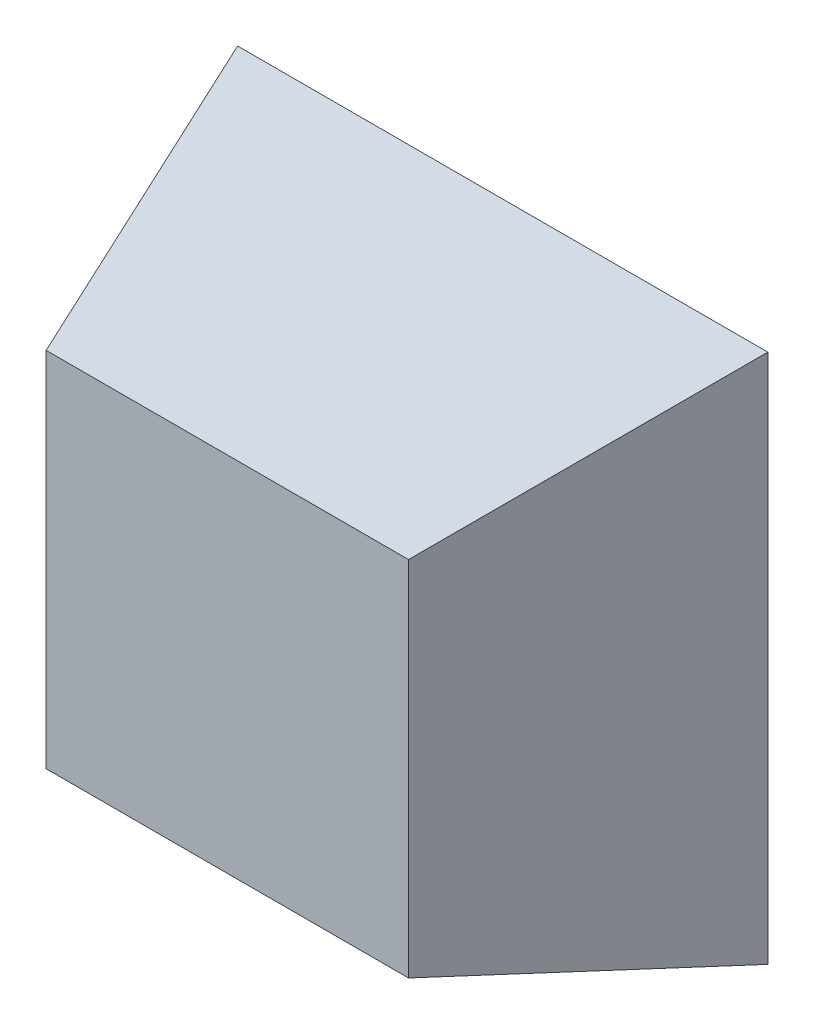
ISO-10303-21;
HEADER;
FILE_DESCRIPTION(('STEP AP214'),'2;1');
FILE_NAME('part.step','',(''),(''),'','','');
FILE_SCHEMA(('AUTOMOTIVE_DESIGN { 1 0 10303 214 1 1 1 1 }'));
ENDSEC;
DATA;
#1=APPLICATION_CONTEXT('core data for automotive mechanical design processes');
#2=APPLICATION_PROTOCOL_DEFINITION('international standard','automotive_design',2000,#1);
#3=PRODUCT_CONTEXT('',#1,'mechanical');
#4=PRODUCT('Part','Part','',(#3));
#5=PRODUCT_RELATED_PRODUCT_CATEGORY('part','',(#4));
#6=PRODUCT_DEFINITION_FORMATION('','',#4);
#7=PRODUCT_DEFINITION_CONTEXT('part definition',#1,'design');
#8=PRODUCT_DEFINITION('design','',#6,#7);
#9=PRODUCT_DEFINITION_SHAPE('','',#8);
#10=(LENGTH_UNIT() NAMED_UNIT(*) SI_UNIT(.MILLI.,.METRE.));
#11=(NAMED_UNIT(*) PLANE_ANGLE_UNIT() SI_UNIT($,.RADIAN.));
#12=(NAMED_UNIT(*) SI_UNIT($,.STERADIAN.) SOLID_ANGLE_UNIT());
#13=UNCERTAINTY_MEASURE_WITH_UNIT(LENGTH_MEASURE(1.E-05),#10,'distance_accuracy_value','');
#14=(GEOMETRIC_REPRESENTATION_CONTEXT(3) GLOBAL_UNCERTAINTY_ASSIGNED_CONTEXT((#13)) GLOBAL_UNIT_ASSIGNED_CONTEXT((#10,
#11,#12)) REPRESENTATION_CONTEXT('',''));
#15=CARTESIAN_POINT('',(0.,0.,0.));
#16=DIRECTION('',(0.,0.,1.));
#17=DIRECTION('',(1.,0.,0.));
#18=AXIS2_PLACEMENT_3D('',#15,#16,#17);
#19=CARTESIAN_POINT('',(0.,0.,-4.));
#20=DIRECTION('',(0.,0.,1.));
#21=DIRECTION('',(1.,0.,0.));
#22=AXIS2_PLACEMENT_3D('',#19,#20,#21);
#23=PLANE('',#22);
#24=DIRECTION('',(1.,0.,0.));
#25=VECTOR('',#24,1.);
#26=CARTESIAN_POINT('',(-2.9,-2.,-4.));
#27=LINE('',#26,#25);
#28=CARTESIAN_POINT('',(0.729999999999999,-2.,-4.));
#29=VERTEX_POINT('',#28);
#30=CARTESIAN_POINT('',(2.9,-2.,-4.));
#31=VERTEX_POINT('',#30);
#32=EDGE_CURVE('E404',#29,#31,#27,.T.);
#33=ORIENTED_EDGE('',*,*,#32,.F.);
#34=DIRECTION('',(0.,-1.,0.));
#35=VECTOR('',#34,1.);
#36=CARTESIAN_POINT('',(0.729999999999999,-2.15,-4.));
#37=LINE('',#36,#35);
#38=CARTESIAN_POINT('',(0.729999999999999,-0.73,-4.));
#39=VERTEX_POINT('',#38);
#40=EDGE_CURVE('E292',#39,#29,#37,.T.);
#41=ORIENTED_EDGE('',*,*,#40,.F.);
#42=DIRECTION('',(-1.,0.,0.));
#43=VECTOR('',#42,1.);
#44=CARTESIAN_POINT('',(0.729999999999999,-0.73,-4.));
#45=LINE('',#44,#43);
#46=CARTESIAN_POINT('',(2.15,-0.73,-4.));
#47=VERTEX_POINT('',#46);
#48=EDGE_CURVE('E348',#47,#39,#45,.T.);
#49=ORIENTED_EDGE('',*,*,#48,.F.);
#50=DIRECTION('',(0.,-1.,0.));
#51=VECTOR('',#50,1.);
#52=CARTESIAN_POINT('',(2.15,0.73,-4.));
#53=LINE('',#52,#51);
#54=CARTESIAN_POINT('',(2.15,0.73,-4.));
#55=VERTEX_POINT('',#54);
#56=EDGE_CURVE('E344',#55,#47,#53,.T.);
#57=ORIENTED_EDGE('',*,*,#56,.F.);
#58=DIRECTION('',(1.,0.,0.));
#59=VECTOR('',#58,1.);
#60=CARTESIAN_POINT('',(0.73,0.73,-4.));
#61=LINE('',#60,#59);
#62=CARTESIAN_POINT('',(0.73,0.73,-4.));
#63=VERTEX_POINT('',#62);
#64=EDGE_CURVE('E340',#63,#55,#61,.T.);
#65=ORIENTED_EDGE('',*,*,#64,.F.);
#66=DIRECTION('',(0.,1.,0.));
#67=VECTOR('',#66,1.);
#68=CARTESIAN_POINT('',(0.729999999999999,0.,-4.));
#69=LINE('',#68,#67);
#70=CARTESIAN_POINT('',(0.73,2.,-4.));
#71=VERTEX_POINT('',#70);
#72=EDGE_CURVE('E58',#63,#71,#69,.T.);
#73=ORIENTED_EDGE('',*,*,#72,.T.);
#74=DIRECTION('',(-1.,0.,0.));
#75=VECTOR('',#74,1.);
#76=CARTESIAN_POINT('',(-2.9,2.,-4.));
#77=LINE('',#76,#75);
#78=CARTESIAN_POINT('',(2.9,2.,-4.));
#79=VERTEX_POINT('',#78);
#80=EDGE_CURVE('E411',#79,#71,#77,.T.);
#81=ORIENTED_EDGE('',*,*,#80,.F.);
#82=DIRECTION('',(0.,1.,0.));
#83=VECTOR('',#82,1.);
#84=CARTESIAN_POINT('',(2.9,2.,-4.));
#85=LINE('',#84,#83);
#86=EDGE_CURVE('E416',#31,#79,#85,.T.);
#87=ORIENTED_EDGE('',*,*,#86,.F.);
#88=EDGE_LOOP('',(#33,#41,#49,#57,#65,#73,#81,#87));
#89=FACE_BOUND('',#88,.T.);
#90=ADVANCED_FACE('F48',(#89),#23,.F.);
#91=CARTESIAN_POINT('',(0.,0.,6.9));
#92=DIRECTION('',(0.,0.,1.));
#93=DIRECTION('',(1.,0.,0.));
#94=AXIS2_PLACEMENT_3D('',#91,#92,#93);
#95=PLANE('',#94);
#96=DIRECTION('',(0.,1.,0.));
#97=VECTOR('',#96,1.);
#98=CARTESIAN_POINT('',(4.33342731390715,0.,6.9));
#99=LINE('',#98,#97);
#100=CARTESIAN_POINT('',(4.33342731390715,-4.33342731390715,6.9));
#101=VERTEX_POINT('',#100);
#102=CARTESIAN_POINT('',(4.33342731390715,4.33342731390715,6.9));
#103=VERTEX_POINT('',#102);
#104=EDGE_CURVE('E443',#101,#103,#99,.T.);
#105=ORIENTED_EDGE('',*,*,#104,.F.);
#106=DIRECTION('',(1.,0.,0.));
#107=VECTOR('',#106,1.);
#108=CARTESIAN_POINT('',(0.,-4.33342731390715,6.9));
#109=LINE('',#108,#107);
#110=CARTESIAN_POINT('',(-4.33342731390715,-4.33342731390715,6.9));
#111=VERTEX_POINT('',#110);
#112=EDGE_CURVE('E447',#111,#101,#109,.T.);
#113=ORIENTED_EDGE('',*,*,#112,.F.);
#114=DIRECTION('',(0.,-1.,0.));
#115=VECTOR('',#114,1.);
#116=CARTESIAN_POINT('',(-4.33342731390715,0.,6.9));
#117=LINE('',#116,#115);
#118=CARTESIAN_POINT('',(-4.33342731390715,4.33342731390715,6.9));
#119=VERTEX_POINT('',#118);
#120=EDGE_CURVE('E453',#119,#111,#117,.T.);
#121=ORIENTED_EDGE('',*,*,#120,.F.);
#122=DIRECTION('',(-1.,0.,0.));
#123=VECTOR('',#122,1.);
#124=CARTESIAN_POINT('',(0.,4.33342731390715,6.9));
#125=LINE('',#124,#123);
#126=EDGE_CURVE('E449',#103,#119,#125,.T.);
#127=ORIENTED_EDGE('',*,*,#126,.F.);
#128=EDGE_LOOP('',(#105,#113,#121,#127));
#129=FACE_BOUND('',#128,.T.);
#130=DIRECTION('',(0.,1.,0.));
#131=VECTOR('',#130,1.);
#132=CARTESIAN_POINT('',(2.9,2.,6.9));
#133=LINE('',#132,#131);
#134=CARTESIAN_POINT('',(2.9,-2.,6.9));
#135=VERTEX_POINT('',#134);
#136=CARTESIAN_POINT('',(2.9,2.,6.9));
#137=VERTEX_POINT('',#136);
#138=EDGE_CURVE('E428',#135,#137,#133,.T.);
#139=ORIENTED_EDGE('',*,*,#138,.T.);
#140=DIRECTION('',(-1.,0.,0.));
#141=VECTOR('',#140,1.);
#142=CARTESIAN_POINT('',(-2.9,2.,6.9));
#143=LINE('',#142,#141);
#144=CARTESIAN_POINT('',(-2.9,2.,6.9));
#145=VERTEX_POINT('',#144);
#146=EDGE_CURVE('E425',#137,#145,#143,.T.);
#147=ORIENTED_EDGE('',*,*,#146,.T.);
#148=DIRECTION('',(0.,-1.,0.));
#149=VECTOR('',#148,1.);
#150=CARTESIAN_POINT('',(-2.9,2.,6.9));
#151=LINE('',#150,#149);
#152=CARTESIAN_POINT('',(-2.9,-2.,6.9));
#153=VERTEX_POINT('',#152);
#154=EDGE_CURVE('E421',#145,#153,#151,.T.);
#155=ORIENTED_EDGE('',*,*,#154,.T.);
#156=DIRECTION('',(1.,0.,0.));
#157=VECTOR('',#156,1.);
#158=CARTESIAN_POINT('',(-2.9,-2.,6.9));
#159=LINE('',#158,#157);
#160=EDGE_CURVE('E403',#153,#135,#159,.T.);
#161=ORIENTED_EDGE('',*,*,#160,.T.);
#162=EDGE_LOOP('',(#139,#147,#155,#161));
#163=FACE_BOUND('',#162,.T.);
#164=ADVANCED_FACE('F727',(#129,#163),#95,.F.);
#165=CARTESIAN_POINT('',(0.,0.,9.4));
#166=DIRECTION('',(0.,0.,1.));
#167=DIRECTION('',(1.,0.,0.));
#168=AXIS2_PLACEMENT_3D('',#165,#166,#167);
#169=PLANE('',#168);
#170=DIRECTION('',(0.,1.,0.));
#171=VECTOR('',#170,1.);
#172=CARTESIAN_POINT('',(6.185,6.185,9.4));
#173=LINE('',#172,#171);
#174=CARTESIAN_POINT('',(6.185,-6.185,9.4));
#175=VERTEX_POINT('',#174);
#176=CARTESIAN_POINT('',(6.185,6.185,9.4));
#177=VERTEX_POINT('',#176);
#178=EDGE_CURVE('E584',#175,#177,#173,.T.);
#179=ORIENTED_EDGE('',*,*,#178,.T.);
#180=DIRECTION('',(-1.,0.,0.));
#181=VECTOR('',#180,1.);
#182=CARTESIAN_POINT('',(-6.185,6.185,9.4));
#183=LINE('',#182,#181);
#184=CARTESIAN_POINT('',(-6.185,6.185,9.4));
#185=VERTEX_POINT('',#184);
#186=EDGE_CURVE('E602',#177,#185,#183,.T.);
#187=ORIENTED_EDGE('',*,*,#186,.T.);
#188=DIRECTION('',(0.,-1.,0.));
#189=VECTOR('',#188,1.);
#190=CARTESIAN_POINT('',(-6.185,6.185,9.4));
#191=LINE('',#190,#189);
#192=CARTESIAN_POINT('',(-6.185,-6.185,9.4));
#193=VERTEX_POINT('',#192);
#194=EDGE_CURVE('E533',#185,#193,#191,.T.);
#195=ORIENTED_EDGE('',*,*,#194,.T.);
#196=DIRECTION('',(1.,0.,0.));
#197=VECTOR('',#196,1.);
#198=CARTESIAN_POINT('',(-6.185,-6.185,9.4));
#199=LINE('',#198,#197);
#200=EDGE_CURVE('E672',#193,#175,#199,.T.);
#201=ORIENTED_EDGE('',*,*,#200,.T.);
#202=EDGE_LOOP('',(#179,#187,#195,#201));
#203=FACE_BOUND('',#202,.T.);
#204=ADVANCED_FACE('F50',(#203),#169,.T.);
#205=CARTESIAN_POINT('',(0.,0.,0.));
#206=DIRECTION('',(0.,0.,1.));
#207=DIRECTION('',(1.,0.,0.));
#208=AXIS2_PLACEMENT_3D('',#205,#206,#207);
#209=PLANE('',#208);
#210=DIRECTION('',(1.,0.,0.));
#211=VECTOR('',#210,1.);
#212=CARTESIAN_POINT('',(0.,-6.43645922880077,0.));
#213=LINE('',#212,#211);
#214=CARTESIAN_POINT('',(-6.43645922880077,-6.43645922880077,0.));
#215=VERTEX_POINT('',#214);
#216=CARTESIAN_POINT('',(6.43645922880077,-6.43645922880077,0.));
#217=VERTEX_POINT('',#216);
#218=EDGE_CURVE('E480',#215,#217,#213,.T.);
#219=ORIENTED_EDGE('',*,*,#218,.T.);
#220=DIRECTION('',(0.,1.,0.));
#221=VECTOR('',#220,1.);
#222=CARTESIAN_POINT('',(6.43645922880077,0.,0.));
#223=LINE('',#222,#221);
#224=CARTESIAN_POINT('',(6.43645922880077,6.43645922880077,0.));
#225=VERTEX_POINT('',#224);
#226=EDGE_CURVE('E424',#217,#225,#223,.T.);
#227=ORIENTED_EDGE('',*,*,#226,.T.);
#228=DIRECTION('',(-1.,0.,0.));
#229=VECTOR('',#228,1.);
#230=CARTESIAN_POINT('',(0.,6.43645922880077,0.));
#231=LINE('',#230,#229);
#232=CARTESIAN_POINT('',(-6.43645922880077,6.43645922880077,0.));
#233=VERTEX_POINT('',#232);
#234=EDGE_CURVE('E463',#225,#233,#231,.T.);
#235=ORIENTED_EDGE('',*,*,#234,.T.);
#236=DIRECTION('',(0.,-1.,0.));
#237=VECTOR('',#236,1.);
#238=CARTESIAN_POINT('',(-6.43645922880077,0.,0.));
#239=LINE('',#238,#237);
#240=EDGE_CURVE('E476',#233,#215,#239,.T.);
#241=ORIENTED_EDGE('',*,*,#240,.T.);
#242=EDGE_LOOP('',(#219,#227,#235,#241));
#243=FACE_BOUND('',#242,.T.);
#244=DIRECTION('',(0.,1.,0.));
#245=VECTOR('',#244,1.);
#246=CARTESIAN_POINT('',(9.05,9.05,0.));
#247=LINE('',#246,#245);
#248=CARTESIAN_POINT('',(9.04999999999999,-9.05,0.));
#249=VERTEX_POINT('',#248);
#250=CARTESIAN_POINT('',(9.05,9.05,0.));
#251=VERTEX_POINT('',#250);
#252=EDGE_CURVE('E452',#249,#251,#247,.T.);
#253=ORIENTED_EDGE('',*,*,#252,.F.);
#254=DIRECTION('',(1.,0.,0.));
#255=VECTOR('',#254,1.);
#256=CARTESIAN_POINT('',(-9.05,-9.05,0.));
#257=LINE('',#256,#255);
#258=CARTESIAN_POINT('',(-9.05,-9.04999999999999,0.));
#259=VERTEX_POINT('',#258);
#260=EDGE_CURVE('E572',#259,#249,#257,.T.);
#261=ORIENTED_EDGE('',*,*,#260,.F.);
#262=DIRECTION('',(0.,-1.,0.));
#263=VECTOR('',#262,1.);
#264=CARTESIAN_POINT('',(-9.05,9.05,0.));
#265=LINE('',#264,#263);
#266=CARTESIAN_POINT('',(-9.05,9.05,0.));
#267=VERTEX_POINT('',#266);
#268=EDGE_CURVE('E609',#267,#259,#265,.T.);
#269=ORIENTED_EDGE('',*,*,#268,.F.);
#270=DIRECTION('',(-1.,0.,0.));
#271=VECTOR('',#270,1.);
#272=CARTESIAN_POINT('',(-9.05,9.05,0.));
#273=LINE('',#272,#271);
#274=EDGE_CURVE('E492',#251,#267,#273,.T.);
#275=ORIENTED_EDGE('',*,*,#274,.F.);
#276=EDGE_LOOP('',(#253,#261,#269,#275));
#277=FACE_BOUND('',#276,.T.);
#278=ADVANCED_FACE('F511',(#243,#277),#209,.F.);
#279=CARTESIAN_POINT('',(0.,8.28075694670788,2.52386900556575));
#280=DIRECTION('',(0.,-0.956556724712148,-0.29154627832982));
#281=DIRECTION('',(0.,0.29154627832982,-0.956556724712148));
#282=AXIS2_PLACEMENT_3D('',#279,#280,#281);
#283=PLANE('',#282);
#284=DIRECTION('',(0.279893482934695,-0.279893482934695,0.91832416739481));
#285=VECTOR('',#284,1.);
#286=CARTESIAN_POINT('',(-9.05,9.05,0.));
#287=LINE('',#286,#285);
#288=EDGE_CURVE('E605',#267,#185,#287,.T.);
#289=ORIENTED_EDGE('',*,*,#288,.T.);
#290=ORIENTED_EDGE('',*,*,#186,.F.);
#291=DIRECTION('',(-0.279893482934695,-0.279893482934695,0.91832416739481));
#292=VECTOR('',#291,1.);
#293=CARTESIAN_POINT('',(9.05,9.05,0.));
#294=LINE('',#293,#292);
#295=EDGE_CURVE('E498',#251,#177,#294,.T.);
#296=ORIENTED_EDGE('',*,*,#295,.F.);
#297=ORIENTED_EDGE('',*,*,#274,.T.);
#298=EDGE_LOOP('',(#289,#290,#296,#297));
#299=FACE_BOUND('',#298,.T.);
#300=ADVANCED_FACE('F500',(#299),#283,.F.);
#301=CARTESIAN_POINT('',(8.28075694670788,0.,2.52386900556575));
#302=DIRECTION('',(-0.956556724712148,0.,-0.29154627832982));
#303=DIRECTION('',(-0.29154627832982,0.,0.956556724712148));
#304=AXIS2_PLACEMENT_3D('',#301,#302,#303);
#305=PLANE('',#304);
#306=ORIENTED_EDGE('',*,*,#295,.T.);
#307=ORIENTED_EDGE('',*,*,#178,.F.);
#308=DIRECTION('',(-0.279893482934695,0.279893482934695,0.91832416739481));
#309=VECTOR('',#308,1.);
#310=CARTESIAN_POINT('',(9.05,-9.05,0.));
#311=LINE('',#310,#309);
#312=EDGE_CURVE('E564',#249,#175,#311,.T.);
#313=ORIENTED_EDGE('',*,*,#312,.F.);
#314=ORIENTED_EDGE('',*,*,#252,.T.);
#315=EDGE_LOOP('',(#306,#307,#313,#314));
#316=FACE_BOUND('',#315,.T.);
#317=ADVANCED_FACE('F510',(#316),#305,.F.);
#318=CARTESIAN_POINT('',(-8.28075694670788,0.,2.52386900556575));
#319=DIRECTION('',(0.956556724712148,0.,-0.29154627832982));
#320=DIRECTION('',(-0.29154627832982,0.,-0.956556724712148));
#321=AXIS2_PLACEMENT_3D('',#318,#319,#320);
#322=PLANE('',#321);
#323=DIRECTION('',(0.279893482934695,0.279893482934695,0.91832416739481));
#324=VECTOR('',#323,1.);
#325=CARTESIAN_POINT('',(-9.05,-9.05,0.));
#326=LINE('',#325,#324);
#327=EDGE_CURVE('E556',#259,#193,#326,.T.);
#328=ORIENTED_EDGE('',*,*,#327,.T.);
#329=ORIENTED_EDGE('',*,*,#194,.F.);
#330=ORIENTED_EDGE('',*,*,#288,.F.);
#331=ORIENTED_EDGE('',*,*,#268,.T.);
#332=EDGE_LOOP('',(#328,#329,#330,#331));
#333=FACE_BOUND('',#332,.T.);
#334=ADVANCED_FACE('F539',(#333),#322,.F.);
#335=CARTESIAN_POINT('',(0.,-8.28075694670788,2.52386900556575));
#336=DIRECTION('',(0.,0.956556724712148,-0.29154627832982));
#337=DIRECTION('',(0.,0.29154627832982,0.956556724712148));
#338=AXIS2_PLACEMENT_3D('',#335,#336,#337);
#339=PLANE('',#338);
#340=DIRECTION('',(1.,0.,0.));
#341=VECTOR('',#340,1.);
#342=CARTESIAN_POINT('',(-6.,-8.34902575818966,2.29988058395015));
#343=LINE('',#342,#341);
#344=CARTESIAN_POINT('',(-6.,-8.34902575818966,2.29988058395015));
#345=VERTEX_POINT('',#344);
#346=CARTESIAN_POINT('',(6.,-8.34902575818966,2.29988058395015));
#347=VERTEX_POINT('',#346);
#348=EDGE_CURVE('E273',#345,#347,#343,.T.);
#349=ORIENTED_EDGE('',*,*,#348,.F.);
#350=DIRECTION('',(0.,-0.291546278329819,-0.956556724712148));
#351=VECTOR('',#350,1.);
#352=CARTESIAN_POINT('',(-6.,-6.59974808821075,8.03922093222304));
#353=LINE('',#352,#351);
#354=CARTESIAN_POINT('',(-6.,-6.59974808821075,8.03922093222304));
#355=VERTEX_POINT('',#354);
#356=EDGE_CURVE('E65',#355,#345,#353,.T.);
#357=ORIENTED_EDGE('',*,*,#356,.F.);
#358=DIRECTION('',(-1.,0.,0.));
#359=VECTOR('',#358,1.);
#360=CARTESIAN_POINT('',(-6.,-6.59974808821075,8.03922093222304));
#361=LINE('',#360,#359);
#362=CARTESIAN_POINT('',(6.,-6.59974808821075,8.03922093222304));
#363=VERTEX_POINT('',#362);
#364=EDGE_CURVE('E260',#363,#355,#361,.T.);
#365=ORIENTED_EDGE('',*,*,#364,.F.);
#366=DIRECTION('',(0.,0.291546278329819,0.956556724712148));
#367=VECTOR('',#366,1.);
#368=CARTESIAN_POINT('',(6.,-6.59974808821075,8.03922093222304));
#369=LINE('',#368,#367);
#370=EDGE_CURVE('E264',#347,#363,#369,.T.);
#371=ORIENTED_EDGE('',*,*,#370,.F.);
#372=EDGE_LOOP('',(#349,#357,#365,#371));
#373=FACE_BOUND('',#372,.T.);
#374=ORIENTED_EDGE('',*,*,#312,.T.);
#375=ORIENTED_EDGE('',*,*,#200,.F.);
#376=ORIENTED_EDGE('',*,*,#327,.F.);
#377=ORIENTED_EDGE('',*,*,#260,.T.);
#378=EDGE_LOOP('',(#374,#375,#376,#377));
#379=FACE_BOUND('',#378,.T.);
#380=ADVANCED_FACE('F547',(#373,#379),#339,.F.);
#381=CARTESIAN_POINT('',(0.,5.88936513492752,1.79500330974121));
#382=DIRECTION('',(0.,-0.956556724712148,-0.29154627832982));
#383=DIRECTION('',(0.,0.29154627832982,-0.956556724712148));
#384=AXIS2_PLACEMENT_3D('',#381,#382,#383);
#385=PLANE('',#384);
#386=DIRECTION('',(0.279893482934695,-0.279893482934695,0.91832416739481));
#387=VECTOR('',#386,1.);
#388=CARTESIAN_POINT('',(-5.42799013954792,5.42799013954792,3.30876420208613));
#389=LINE('',#388,#387);
#390=EDGE_CURVE('E458',#233,#119,#389,.T.);
#391=ORIENTED_EDGE('',*,*,#390,.F.);
#392=ORIENTED_EDGE('',*,*,#234,.F.);
#393=DIRECTION('',(-0.279893482934695,-0.279893482934695,0.91832416739481));
#394=VECTOR('',#393,1.);
#395=CARTESIAN_POINT('',(5.42799013954792,5.42799013954792,3.30876420208613));
#396=LINE('',#395,#394);
#397=EDGE_CURVE('E462',#225,#103,#396,.T.);
#398=ORIENTED_EDGE('',*,*,#397,.T.);
#399=ORIENTED_EDGE('',*,*,#126,.T.);
#400=EDGE_LOOP('',(#391,#392,#398,#399));
#401=FACE_BOUND('',#400,.T.);
#402=ADVANCED_FACE('F740',(#401),#385,.T.);
#403=CARTESIAN_POINT('',(5.88936513492752,0.,1.79500330974121));
#404=DIRECTION('',(-0.956556724712148,0.,-0.29154627832982));
#405=DIRECTION('',(-0.29154627832982,0.,0.956556724712148));
#406=AXIS2_PLACEMENT_3D('',#403,#404,#405);
#407=PLANE('',#406);
#408=ORIENTED_EDGE('',*,*,#397,.F.);
#409=ORIENTED_EDGE('',*,*,#226,.F.);
#410=DIRECTION('',(-0.279893482934695,0.279893482934695,0.91832416739481));
#411=VECTOR('',#410,1.);
#412=CARTESIAN_POINT('',(5.42799013954792,-5.42799013954792,3.30876420208613));
#413=LINE('',#412,#411);
#414=EDGE_CURVE('E448',#217,#101,#413,.T.);
#415=ORIENTED_EDGE('',*,*,#414,.T.);
#416=ORIENTED_EDGE('',*,*,#104,.T.);
#417=EDGE_LOOP('',(#408,#409,#415,#416));
#418=FACE_BOUND('',#417,.T.);
#419=ADVANCED_FACE('F743',(#418),#407,.T.);
#420=CARTESIAN_POINT('',(-5.88936513492752,0.,1.79500330974121));
#421=DIRECTION('',(0.956556724712148,0.,-0.29154627832982));
#422=DIRECTION('',(-0.29154627832982,0.,-0.956556724712148));
#423=AXIS2_PLACEMENT_3D('',#420,#421,#422);
#424=PLANE('',#423);
#425=DIRECTION('',(0.279893482934695,0.279893482934695,0.91832416739481));
#426=VECTOR('',#425,1.);
#427=CARTESIAN_POINT('',(-5.42799013954792,-5.42799013954792,3.30876420208613));
#428=LINE('',#427,#426);
#429=EDGE_CURVE('E466',#215,#111,#428,.T.);
#430=ORIENTED_EDGE('',*,*,#429,.F.);
#431=ORIENTED_EDGE('',*,*,#240,.F.);
#432=ORIENTED_EDGE('',*,*,#390,.T.);
#433=ORIENTED_EDGE('',*,*,#120,.T.);
#434=EDGE_LOOP('',(#430,#431,#432,#433));
#435=FACE_BOUND('',#434,.T.);
#436=ADVANCED_FACE('F747',(#435),#424,.T.);
#437=CARTESIAN_POINT('',(0.,-5.88936513492752,1.79500330974121));
#438=DIRECTION('',(0.,0.956556724712148,-0.29154627832982));
#439=DIRECTION('',(0.,0.29154627832982,0.956556724712148));
#440=AXIS2_PLACEMENT_3D('',#437,#438,#439);
#441=PLANE('',#440);
#442=ORIENTED_EDGE('',*,*,#414,.F.);
#443=ORIENTED_EDGE('',*,*,#218,.F.);
#444=ORIENTED_EDGE('',*,*,#429,.T.);
#445=ORIENTED_EDGE('',*,*,#112,.T.);
#446=EDGE_LOOP('',(#442,#443,#444,#445));
#447=FACE_BOUND('',#446,.T.);
#448=ADVANCED_FACE('F750',(#447),#441,.T.);
#449=CARTESIAN_POINT('',(2.9,2.,13.9455659815234));
#450=DIRECTION('',(-1.,0.,0.));
#451=DIRECTION('',(0.,0.,1.));
#452=AXIS2_PLACEMENT_3D('',#449,#450,#451);
#453=PLANE('',#452);
#454=ORIENTED_EDGE('',*,*,#138,.F.);
#455=DIRECTION('',(0.,0.,-1.));
#456=VECTOR('',#455,1.);
#457=CARTESIAN_POINT('',(2.9,-2.,13.9455659815234));
#458=LINE('',#457,#456);
#459=EDGE_CURVE('E398',#135,#31,#458,.T.);
#460=ORIENTED_EDGE('',*,*,#459,.T.);
#461=ORIENTED_EDGE('',*,*,#86,.T.);
#462=DIRECTION('',(0.,0.,-1.));
#463=VECTOR('',#462,1.);
#464=CARTESIAN_POINT('',(2.9,2.,13.9455659815234));
#465=LINE('',#464,#463);
#466=EDGE_CURVE('E420',#137,#79,#465,.T.);
#467=ORIENTED_EDGE('',*,*,#466,.F.);
#468=EDGE_LOOP('',(#454,#460,#461,#467));
#469=FACE_BOUND('',#468,.T.);
#470=ADVANCED_FACE('F706',(#469),#453,.F.);
#471=CARTESIAN_POINT('',(-2.9,2.,13.9455659815234));
#472=DIRECTION('',(0.,-1.,0.));
#473=DIRECTION('',(0.,0.,-1.));
#474=AXIS2_PLACEMENT_3D('',#471,#472,#473);
#475=PLANE('',#474);
#476=ORIENTED_EDGE('',*,*,#80,.T.);
#477=DIRECTION('',(0.,0.,1.));
#478=VECTOR('',#477,1.);
#479=CARTESIAN_POINT('',(0.73,2.,13.9455659815234));
#480=LINE('',#479,#478);
#481=CARTESIAN_POINT('',(0.73,2.,0.));
#482=VERTEX_POINT('',#481);
#483=EDGE_CURVE('E382',#71,#482,#480,.T.);
#484=ORIENTED_EDGE('',*,*,#483,.T.);
#485=DIRECTION('',(-1.,0.,0.));
#486=VECTOR('',#485,1.);
#487=CARTESIAN_POINT('',(-2.9,2.,0.));
#488=LINE('',#487,#486);
#489=CARTESIAN_POINT('',(-0.73,2.,0.));
#490=VERTEX_POINT('',#489);
#491=EDGE_CURVE('E394',#482,#490,#488,.T.);
#492=ORIENTED_EDGE('',*,*,#491,.T.);
#493=DIRECTION('',(0.,0.,-1.));
#494=VECTOR('',#493,1.);
#495=CARTESIAN_POINT('',(-0.73,2.,13.9455659815234));
#496=LINE('',#495,#494);
#497=CARTESIAN_POINT('',(-0.73,2.,-4.));
#498=VERTEX_POINT('',#497);
#499=EDGE_CURVE('E357',#490,#498,#496,.T.);
#500=ORIENTED_EDGE('',*,*,#499,.T.);
#501=CARTESIAN_POINT('',(-2.9,2.,-4.));
#502=VERTEX_POINT('',#501);
#503=EDGE_CURVE('E415',#498,#502,#77,.T.);
#504=ORIENTED_EDGE('',*,*,#503,.T.);
#505=DIRECTION('',(0.,0.,-1.));
#506=VECTOR('',#505,1.);
#507=CARTESIAN_POINT('',(-2.9,2.,13.9455659815234));
#508=LINE('',#507,#506);
#509=EDGE_CURVE('E410',#145,#502,#508,.T.);
#510=ORIENTED_EDGE('',*,*,#509,.F.);
#511=ORIENTED_EDGE('',*,*,#146,.F.);
#512=ORIENTED_EDGE('',*,*,#466,.T.);
#513=EDGE_LOOP('',(#476,#484,#492,#500,#504,#510,#511,#512));
#514=FACE_BOUND('',#513,.T.);
#515=ADVANCED_FACE('F700',(#514),#475,.F.);
#516=CARTESIAN_POINT('',(-2.9,2.,13.9455659815234));
#517=DIRECTION('',(1.,0.,0.));
#518=DIRECTION('',(0.,0.,-1.));
#519=AXIS2_PLACEMENT_3D('',#516,#517,#518);
#520=PLANE('',#519);
#521=ORIENTED_EDGE('',*,*,#154,.F.);
#522=ORIENTED_EDGE('',*,*,#509,.T.);
#523=DIRECTION('',(0.,-1.,0.));
#524=VECTOR('',#523,1.);
#525=CARTESIAN_POINT('',(-2.9,2.,-4.));
#526=LINE('',#525,#524);
#527=CARTESIAN_POINT('',(-2.9,-2.,-4.));
#528=VERTEX_POINT('',#527);
#529=EDGE_CURVE('E405',#502,#528,#526,.T.);
#530=ORIENTED_EDGE('',*,*,#529,.T.);
#531=DIRECTION('',(0.,0.,-1.));
#532=VECTOR('',#531,1.);
#533=CARTESIAN_POINT('',(-2.9,-2.,13.9455659815234));
#534=LINE('',#533,#532);
#535=EDGE_CURVE('E409',#153,#528,#534,.T.);
#536=ORIENTED_EDGE('',*,*,#535,.F.);
#537=EDGE_LOOP('',(#521,#522,#530,#536));
#538=FACE_BOUND('',#537,.T.);
#539=ADVANCED_FACE('F719',(#538),#520,.F.);
#540=CARTESIAN_POINT('',(-2.9,-2.,13.9455659815234));
#541=DIRECTION('',(0.,1.,0.));
#542=DIRECTION('',(0.,0.,1.));
#543=AXIS2_PLACEMENT_3D('',#540,#541,#542);
#544=PLANE('',#543);
#545=CARTESIAN_POINT('',(-0.73,-2.,-4.));
#546=VERTEX_POINT('',#545);
#547=EDGE_CURVE('E399',#528,#546,#27,.T.);
#548=ORIENTED_EDGE('',*,*,#547,.T.);
#549=DIRECTION('',(0.,0.,1.));
#550=VECTOR('',#549,1.);
#551=CARTESIAN_POINT('',(-0.73,-2.,13.9455659815234));
#552=LINE('',#551,#550);
#553=CARTESIAN_POINT('',(-0.73,-2.,0.));
#554=VERTEX_POINT('',#553);
#555=EDGE_CURVE('E390',#546,#554,#552,.T.);
#556=ORIENTED_EDGE('',*,*,#555,.T.);
#557=DIRECTION('',(1.,0.,0.));
#558=VECTOR('',#557,1.);
#559=CARTESIAN_POINT('',(-2.9,-2.,0.));
#560=LINE('',#559,#558);
#561=CARTESIAN_POINT('',(0.729999999999999,-2.,0.));
#562=VERTEX_POINT('',#561);
#563=EDGE_CURVE('E12',#554,#562,#560,.T.);
#564=ORIENTED_EDGE('',*,*,#563,.T.);
#565=DIRECTION('',(0.,0.,-1.));
#566=VECTOR('',#565,1.);
#567=CARTESIAN_POINT('',(0.729999999999999,-2.,13.9455659815234));
#568=LINE('',#567,#566);
#569=EDGE_CURVE('E386',#562,#29,#568,.T.);
#570=ORIENTED_EDGE('',*,*,#569,.T.);
#571=ORIENTED_EDGE('',*,*,#32,.T.);
#572=ORIENTED_EDGE('',*,*,#459,.F.);
#573=ORIENTED_EDGE('',*,*,#160,.F.);
#574=ORIENTED_EDGE('',*,*,#535,.T.);
#575=EDGE_LOOP('',(#548,#556,#564,#570,#571,#572,#573,#574));
#576=FACE_BOUND('',#575,.T.);
#577=ADVANCED_FACE('F724',(#576),#544,.F.);
#578=DIRECTION('',(-1.,0.,0.));
#579=VECTOR('',#578,1.);
#580=CARTESIAN_POINT('',(-0.73,-0.730000000000001,-4.));
#581=LINE('',#580,#579);
#582=CARTESIAN_POINT('',(-0.73,-0.730000000000001,-4.));
#583=VERTEX_POINT('',#582);
#584=CARTESIAN_POINT('',(-2.15,-0.730000000000001,-4.));
#585=VERTEX_POINT('',#584);
#586=EDGE_CURVE('E282',#583,#585,#581,.T.);
#587=ORIENTED_EDGE('',*,*,#586,.F.);
#588=DIRECTION('',(0.,-1.,0.));
#589=VECTOR('',#588,1.);
#590=CARTESIAN_POINT('',(-0.729999999999999,0.,-4.));
#591=LINE('',#590,#589);
#592=EDGE_CURVE('E655',#583,#546,#591,.T.);
#593=ORIENTED_EDGE('',*,*,#592,.T.);
#594=ORIENTED_EDGE('',*,*,#547,.F.);
#595=ORIENTED_EDGE('',*,*,#529,.F.);
#596=ORIENTED_EDGE('',*,*,#503,.F.);
#597=DIRECTION('',(0.,1.,0.));
#598=VECTOR('',#597,1.);
#599=CARTESIAN_POINT('',(-0.73,2.15,-4.));
#600=LINE('',#599,#598);
#601=CARTESIAN_POINT('',(-0.73,0.729999999999998,-4.));
#602=VERTEX_POINT('',#601);
#603=EDGE_CURVE('E337',#602,#498,#600,.T.);
#604=ORIENTED_EDGE('',*,*,#603,.F.);
#605=DIRECTION('',(1.,0.,0.));
#606=VECTOR('',#605,1.);
#607=CARTESIAN_POINT('',(-0.73,0.729999999999998,-4.));
#608=LINE('',#607,#606);
#609=CARTESIAN_POINT('',(-2.15,0.729999999999999,-4.));
#610=VERTEX_POINT('',#609);
#611=EDGE_CURVE('E333',#610,#602,#608,.T.);
#612=ORIENTED_EDGE('',*,*,#611,.F.);
#613=DIRECTION('',(0.,1.,0.));
#614=VECTOR('',#613,1.);
#615=CARTESIAN_POINT('',(-2.15,0.729999999999999,-4.));
#616=LINE('',#615,#614);
#617=EDGE_CURVE('E329',#585,#610,#616,.T.);
#618=ORIENTED_EDGE('',*,*,#617,.F.);
#619=EDGE_LOOP('',(#587,#593,#594,#595,#596,#604,#612,#618));
#620=FACE_BOUND('',#619,.T.);
#621=ADVANCED_FACE('F723',(#620),#23,.F.);
#622=CARTESIAN_POINT('',(0.,0.,0.));
#623=DIRECTION('',(0.,0.,1.));
#624=DIRECTION('',(1.,0.,0.));
#625=AXIS2_PLACEMENT_3D('',#622,#623,#624);
#626=PLANE('',#625);
#627=DIRECTION('',(0.,-1.,0.));
#628=VECTOR('',#627,1.);
#629=CARTESIAN_POINT('',(0.73,2.15,0.));
#630=LINE('',#629,#628);
#631=CARTESIAN_POINT('',(0.73,0.73,0.));
#632=VERTEX_POINT('',#631);
#633=EDGE_CURVE('E308',#482,#632,#630,.T.);
#634=ORIENTED_EDGE('',*,*,#633,.T.);
#635=DIRECTION('',(1.,0.,0.));
#636=VECTOR('',#635,1.);
#637=CARTESIAN_POINT('',(0.73,0.73,0.));
#638=LINE('',#637,#636);
#639=CARTESIAN_POINT('',(2.15,0.73,0.));
#640=VERTEX_POINT('',#639);
#641=EDGE_CURVE('E311',#632,#640,#638,.T.);
#642=ORIENTED_EDGE('',*,*,#641,.T.);
#643=DIRECTION('',(0.,-1.,0.));
#644=VECTOR('',#643,1.);
#645=CARTESIAN_POINT('',(2.15,0.73,0.));
#646=LINE('',#645,#644);
#647=CARTESIAN_POINT('',(2.15,-0.73,0.));
#648=VERTEX_POINT('',#647);
#649=EDGE_CURVE('E315',#640,#648,#646,.T.);
#650=ORIENTED_EDGE('',*,*,#649,.T.);
#651=DIRECTION('',(-1.,0.,0.));
#652=VECTOR('',#651,1.);
#653=CARTESIAN_POINT('',(0.729999999999999,-0.73,0.));
#654=LINE('',#653,#652);
#655=CARTESIAN_POINT('',(0.729999999999999,-0.73,0.));
#656=VERTEX_POINT('',#655);
#657=EDGE_CURVE('E319',#648,#656,#654,.T.);
#658=ORIENTED_EDGE('',*,*,#657,.T.);
#659=DIRECTION('',(0.,-1.,0.));
#660=VECTOR('',#659,1.);
#661=CARTESIAN_POINT('',(0.729999999999999,-2.15,0.));
#662=LINE('',#661,#660);
#663=EDGE_CURVE('E323',#656,#562,#662,.T.);
#664=ORIENTED_EDGE('',*,*,#663,.T.);
#665=ORIENTED_EDGE('',*,*,#563,.F.);
#666=DIRECTION('',(0.,1.,0.));
#667=VECTOR('',#666,1.);
#668=CARTESIAN_POINT('',(-0.73,-2.15,0.));
#669=LINE('',#668,#667);
#670=CARTESIAN_POINT('',(-0.73,-0.730000000000001,0.));
#671=VERTEX_POINT('',#670);
#672=EDGE_CURVE('E288',#554,#671,#669,.T.);
#673=ORIENTED_EDGE('',*,*,#672,.T.);
#674=DIRECTION('',(-1.,0.,0.));
#675=VECTOR('',#674,1.);
#676=CARTESIAN_POINT('',(-0.73,-0.730000000000001,0.));
#677=LINE('',#676,#675);
#678=CARTESIAN_POINT('',(-2.15,-0.730000000000001,0.));
#679=VERTEX_POINT('',#678);
#680=EDGE_CURVE('E291',#671,#679,#677,.T.);
#681=ORIENTED_EDGE('',*,*,#680,.T.);
#682=DIRECTION('',(0.,1.,0.));
#683=VECTOR('',#682,1.);
#684=CARTESIAN_POINT('',(-2.15,0.729999999999999,0.));
#685=LINE('',#684,#683);
#686=CARTESIAN_POINT('',(-2.15,0.729999999999999,0.));
#687=VERTEX_POINT('',#686);
#688=EDGE_CURVE('E296',#679,#687,#685,.T.);
#689=ORIENTED_EDGE('',*,*,#688,.T.);
#690=DIRECTION('',(1.,0.,0.));
#691=VECTOR('',#690,1.);
#692=CARTESIAN_POINT('',(-0.73,0.729999999999998,0.));
#693=LINE('',#692,#691);
#694=CARTESIAN_POINT('',(-0.73,0.729999999999998,0.));
#695=VERTEX_POINT('',#694);
#696=EDGE_CURVE('E300',#687,#695,#693,.T.);
#697=ORIENTED_EDGE('',*,*,#696,.T.);
#698=DIRECTION('',(0.,1.,0.));
#699=VECTOR('',#698,1.);
#700=CARTESIAN_POINT('',(-0.73,2.15,0.));
#701=LINE('',#700,#699);
#702=EDGE_CURVE('E304',#695,#490,#701,.T.);
#703=ORIENTED_EDGE('',*,*,#702,.T.);
#704=ORIENTED_EDGE('',*,*,#491,.F.);
#705=EDGE_LOOP('',(#634,#642,#650,#658,#664,#665,#673,#681,#689,#697,#703,#704));
#706=FACE_BOUND('',#705,.T.);
#707=ADVANCED_FACE('F856',(#706),#626,.F.);
#708=CARTESIAN_POINT('',(-0.73,-2.15,0.));
#709=DIRECTION('',(-1.,0.,0.));
#710=DIRECTION('',(0.,-1.,0.));
#711=AXIS2_PLACEMENT_3D('',#708,#709,#710);
#712=PLANE('',#711);
#713=ORIENTED_EDGE('',*,*,#592,.F.);
#714=DIRECTION('',(0.,0.,-1.));
#715=VECTOR('',#714,1.);
#716=CARTESIAN_POINT('',(-0.73,-0.730000000000001,0.));
#717=LINE('',#716,#715);
#718=EDGE_CURVE('E73',#671,#583,#717,.T.);
#719=ORIENTED_EDGE('',*,*,#718,.F.);
#720=ORIENTED_EDGE('',*,*,#672,.F.);
#721=ORIENTED_EDGE('',*,*,#555,.F.);
#722=EDGE_LOOP('',(#713,#719,#720,#721));
#723=FACE_BOUND('',#722,.T.);
#724=ADVANCED_FACE('F863',(#723),#712,.F.);
#725=CARTESIAN_POINT('',(0.729999999999999,-2.15,0.));
#726=DIRECTION('',(1.,0.,0.));
#727=DIRECTION('',(0.,1.,0.));
#728=AXIS2_PLACEMENT_3D('',#725,#726,#727);
#729=PLANE('',#728);
#730=ORIENTED_EDGE('',*,*,#663,.F.);
#731=DIRECTION('',(0.,0.,-1.));
#732=VECTOR('',#731,1.);
#733=CARTESIAN_POINT('',(0.729999999999999,-0.73,0.));
#734=LINE('',#733,#732);
#735=EDGE_CURVE('E354',#656,#39,#734,.T.);
#736=ORIENTED_EDGE('',*,*,#735,.T.);
#737=ORIENTED_EDGE('',*,*,#40,.T.);
#738=ORIENTED_EDGE('',*,*,#569,.F.);
#739=EDGE_LOOP('',(#730,#736,#737,#738));
#740=FACE_BOUND('',#739,.T.);
#741=ADVANCED_FACE('F873',(#740),#729,.F.);
#742=CARTESIAN_POINT('',(0.73,2.15,0.));
#743=DIRECTION('',(1.,0.,0.));
#744=DIRECTION('',(0.,1.,0.));
#745=AXIS2_PLACEMENT_3D('',#742,#743,#744);
#746=PLANE('',#745);
#747=ORIENTED_EDGE('',*,*,#72,.F.);
#748=DIRECTION('',(0.,0.,-1.));
#749=VECTOR('',#748,1.);
#750=CARTESIAN_POINT('',(0.73,0.73,0.));
#751=LINE('',#750,#749);
#752=EDGE_CURVE('E364',#632,#63,#751,.T.);
#753=ORIENTED_EDGE('',*,*,#752,.F.);
#754=ORIENTED_EDGE('',*,*,#633,.F.);
#755=ORIENTED_EDGE('',*,*,#483,.F.);
#756=EDGE_LOOP('',(#747,#753,#754,#755));
#757=FACE_BOUND('',#756,.T.);
#758=ADVANCED_FACE('F883',(#757),#746,.F.);
#759=CARTESIAN_POINT('',(-0.73,2.15,0.));
#760=DIRECTION('',(-1.,0.,0.));
#761=DIRECTION('',(0.,0.,1.));
#762=AXIS2_PLACEMENT_3D('',#759,#760,#761);
#763=PLANE('',#762);
#764=ORIENTED_EDGE('',*,*,#702,.F.);
#765=DIRECTION('',(0.,0.,-1.));
#766=VECTOR('',#765,1.);
#767=CARTESIAN_POINT('',(-0.73,0.729999999999998,0.));
#768=LINE('',#767,#766);
#769=EDGE_CURVE('E368',#695,#602,#768,.T.);
#770=ORIENTED_EDGE('',*,*,#769,.T.);
#771=ORIENTED_EDGE('',*,*,#603,.T.);
#772=ORIENTED_EDGE('',*,*,#499,.F.);
#773=EDGE_LOOP('',(#764,#770,#771,#772));
#774=FACE_BOUND('',#773,.T.);
#775=ADVANCED_FACE('F893',(#774),#763,.F.);
#776=CARTESIAN_POINT('',(0.729999999999999,-0.73,0.));
#777=DIRECTION('',(0.,-1.,0.));
#778=DIRECTION('',(0.,0.,-1.));
#779=AXIS2_PLACEMENT_3D('',#776,#777,#778);
#780=PLANE('',#779);
#781=ORIENTED_EDGE('',*,*,#48,.T.);
#782=ORIENTED_EDGE('',*,*,#735,.F.);
#783=ORIENTED_EDGE('',*,*,#657,.F.);
#784=DIRECTION('',(0.,0.,-1.));
#785=VECTOR('',#784,1.);
#786=CARTESIAN_POINT('',(2.15,-0.73,0.));
#787=LINE('',#786,#785);
#788=EDGE_CURVE('E358',#648,#47,#787,.T.);
#789=ORIENTED_EDGE('',*,*,#788,.T.);
#790=EDGE_LOOP('',(#781,#782,#783,#789));
#791=FACE_BOUND('',#790,.T.);
#792=ADVANCED_FACE('F902',(#791),#780,.F.);
#793=CARTESIAN_POINT('',(2.15,0.73,0.));
#794=DIRECTION('',(1.,0.,0.));
#795=DIRECTION('',(0.,1.,0.));
#796=AXIS2_PLACEMENT_3D('',#793,#794,#795);
#797=PLANE('',#796);
#798=ORIENTED_EDGE('',*,*,#56,.T.);
#799=ORIENTED_EDGE('',*,*,#788,.F.);
#800=ORIENTED_EDGE('',*,*,#649,.F.);
#801=DIRECTION('',(0.,0.,-1.));
#802=VECTOR('',#801,1.);
#803=CARTESIAN_POINT('',(2.15,0.73,0.));
#804=LINE('',#803,#802);
#805=EDGE_CURVE('E361',#640,#55,#804,.T.);
#806=ORIENTED_EDGE('',*,*,#805,.T.);
#807=EDGE_LOOP('',(#798,#799,#800,#806));
#808=FACE_BOUND('',#807,.T.);
#809=ADVANCED_FACE('F912',(#808),#797,.F.);
#810=CARTESIAN_POINT('',(0.73,0.73,0.));
#811=DIRECTION('',(0.,1.,0.));
#812=DIRECTION('',(-1.,0.,0.));
#813=AXIS2_PLACEMENT_3D('',#810,#811,#812);
#814=PLANE('',#813);
#815=ORIENTED_EDGE('',*,*,#64,.T.);
#816=ORIENTED_EDGE('',*,*,#805,.F.);
#817=ORIENTED_EDGE('',*,*,#641,.F.);
#818=ORIENTED_EDGE('',*,*,#752,.T.);
#819=EDGE_LOOP('',(#815,#816,#817,#818));
#820=FACE_BOUND('',#819,.T.);
#821=ADVANCED_FACE('F922',(#820),#814,.F.);
#822=CARTESIAN_POINT('',(-0.73,0.729999999999998,0.));
#823=DIRECTION('',(0.,1.,0.));
#824=DIRECTION('',(-1.,0.,0.));
#825=AXIS2_PLACEMENT_3D('',#822,#823,#824);
#826=PLANE('',#825);
#827=ORIENTED_EDGE('',*,*,#611,.T.);
#828=ORIENTED_EDGE('',*,*,#769,.F.);
#829=ORIENTED_EDGE('',*,*,#696,.F.);
#830=DIRECTION('',(0.,0.,-1.));
#831=VECTOR('',#830,1.);
#832=CARTESIAN_POINT('',(-2.15,0.729999999999999,0.));
#833=LINE('',#832,#831);
#834=EDGE_CURVE('E371',#687,#610,#833,.T.);
#835=ORIENTED_EDGE('',*,*,#834,.T.);
#836=EDGE_LOOP('',(#827,#828,#829,#835));
#837=FACE_BOUND('',#836,.T.);
#838=ADVANCED_FACE('F932',(#837),#826,.F.);
#839=CARTESIAN_POINT('',(-2.15,0.729999999999999,0.));
#840=DIRECTION('',(-1.,0.,0.));
#841=DIRECTION('',(0.,-1.,0.));
#842=AXIS2_PLACEMENT_3D('',#839,#840,#841);
#843=PLANE('',#842);
#844=ORIENTED_EDGE('',*,*,#617,.T.);
#845=ORIENTED_EDGE('',*,*,#834,.F.);
#846=ORIENTED_EDGE('',*,*,#688,.F.);
#847=DIRECTION('',(0.,0.,-1.));
#848=VECTOR('',#847,1.);
#849=CARTESIAN_POINT('',(-2.15,-0.730000000000001,0.));
#850=LINE('',#849,#848);
#851=EDGE_CURVE('E374',#679,#585,#850,.T.);
#852=ORIENTED_EDGE('',*,*,#851,.T.);
#853=EDGE_LOOP('',(#844,#845,#846,#852));
#854=FACE_BOUND('',#853,.T.);
#855=ADVANCED_FACE('F942',(#854),#843,.F.);
#856=CARTESIAN_POINT('',(-0.73,-0.730000000000001,0.));
#857=DIRECTION('',(0.,-1.,0.));
#858=DIRECTION('',(1.,0.,0.));
#859=AXIS2_PLACEMENT_3D('',#856,#857,#858);
#860=PLANE('',#859);
#861=ORIENTED_EDGE('',*,*,#586,.T.);
#862=ORIENTED_EDGE('',*,*,#851,.F.);
#863=ORIENTED_EDGE('',*,*,#680,.F.);
#864=ORIENTED_EDGE('',*,*,#718,.T.);
#865=EDGE_LOOP('',(#861,#862,#863,#864));
#866=FACE_BOUND('',#865,.T.);
#867=ADVANCED_FACE('F951',(#866),#860,.F.);
#868=CARTESIAN_POINT('',(-6.,-6.3127810707971,7.95175704872409));
#869=DIRECTION('',(-1.,0.,0.));
#870=DIRECTION('',(0.,0.,1.));
#871=AXIS2_PLACEMENT_3D('',#868,#869,#870);
#872=PLANE('',#871);
#873=ORIENTED_EDGE('',*,*,#356,.T.);
#874=DIRECTION('',(0.,-0.956556724712148,0.29154627832982));
#875=VECTOR('',#874,1.);
#876=CARTESIAN_POINT('',(-6.,-8.06205874077602,2.2124167004512));
#877=LINE('',#876,#875);
#878=CARTESIAN_POINT('',(-6.,-8.06205874077602,2.2124167004512));
#879=VERTEX_POINT('',#878);
#880=EDGE_CURVE('E235',#879,#345,#877,.T.);
#881=ORIENTED_EDGE('',*,*,#880,.F.);
#882=DIRECTION('',(0.,-0.291546278329819,-0.956556724712148));
#883=VECTOR('',#882,1.);
#884=CARTESIAN_POINT('',(-6.,-6.3127810707971,7.95175704872409));
#885=LINE('',#884,#883);
#886=CARTESIAN_POINT('',(-6.,-6.3127810707971,7.95175704872409));
#887=VERTEX_POINT('',#886);
#888=EDGE_CURVE('E239',#887,#879,#885,.T.);
#889=ORIENTED_EDGE('',*,*,#888,.F.);
#890=DIRECTION('',(0.,-0.956556724712148,0.29154627832982));
#891=VECTOR('',#890,1.);
#892=CARTESIAN_POINT('',(-6.,-6.3127810707971,7.95175704872409));
#893=LINE('',#892,#891);
#894=EDGE_CURVE('E279',#887,#355,#893,.T.);
#895=ORIENTED_EDGE('',*,*,#894,.T.);
#896=EDGE_LOOP('',(#873,#881,#889,#895));
#897=FACE_BOUND('',#896,.T.);
#898=ADVANCED_FACE('F237',(#897),#872,.F.);
#899=CARTESIAN_POINT('',(-6.,-6.3127810707971,7.95175704872409));
#900=DIRECTION('',(0.,0.29154627832982,0.956556724712148));
#901=DIRECTION('',(0.,-0.956556724712148,0.29154627832982));
#902=AXIS2_PLACEMENT_3D('',#899,#900,#901);
#903=PLANE('',#902);
#904=ORIENTED_EDGE('',*,*,#364,.T.);
#905=ORIENTED_EDGE('',*,*,#894,.F.);
#906=DIRECTION('',(-1.,0.,0.));
#907=VECTOR('',#906,1.);
#908=CARTESIAN_POINT('',(-6.,-6.3127810707971,7.95175704872409));
#909=LINE('',#908,#907);
#910=CARTESIAN_POINT('',(6.,-6.3127810707971,7.95175704872409));
#911=VERTEX_POINT('',#910);
#912=EDGE_CURVE('E246',#911,#887,#909,.T.);
#913=ORIENTED_EDGE('',*,*,#912,.F.);
#914=DIRECTION('',(0.,-0.956556724712148,0.29154627832982));
#915=VECTOR('',#914,1.);
#916=CARTESIAN_POINT('',(6.,-6.3127810707971,7.95175704872409));
#917=LINE('',#916,#915);
#918=EDGE_CURVE('E283',#911,#363,#917,.T.);
#919=ORIENTED_EDGE('',*,*,#918,.T.);
#920=EDGE_LOOP('',(#904,#905,#913,#919));
#921=FACE_BOUND('',#920,.T.);
#922=ADVANCED_FACE('F968',(#921),#903,.F.);
#923=CARTESIAN_POINT('',(6.,-6.3127810707971,7.95175704872409));
#924=DIRECTION('',(1.,0.,0.));
#925=DIRECTION('',(0.,0.,-1.));
#926=AXIS2_PLACEMENT_3D('',#923,#924,#925);
#927=PLANE('',#926);
#928=ORIENTED_EDGE('',*,*,#370,.T.);
#929=ORIENTED_EDGE('',*,*,#918,.F.);
#930=DIRECTION('',(0.,0.291546278329819,0.956556724712148));
#931=VECTOR('',#930,1.);
#932=CARTESIAN_POINT('',(6.,-6.3127810707971,7.95175704872409));
#933=LINE('',#932,#931);
#934=CARTESIAN_POINT('',(6.,-8.06205874077602,2.2124167004512));
#935=VERTEX_POINT('',#934);
#936=EDGE_CURVE('E255',#935,#911,#933,.T.);
#937=ORIENTED_EDGE('',*,*,#936,.F.);
#938=DIRECTION('',(0.,-0.956556724712148,0.29154627832982));
#939=VECTOR('',#938,1.);
#940=CARTESIAN_POINT('',(6.,-8.06205874077602,2.2124167004512));
#941=LINE('',#940,#939);
#942=EDGE_CURVE('E245',#935,#347,#941,.T.);
#943=ORIENTED_EDGE('',*,*,#942,.T.);
#944=EDGE_LOOP('',(#928,#929,#937,#943));
#945=FACE_BOUND('',#944,.T.);
#946=ADVANCED_FACE('F974',(#945),#927,.F.);
#947=CARTESIAN_POINT('',(-6.,-8.06205874077602,2.2124167004512));
#948=DIRECTION('',(0.,-0.29154627832982,-0.956556724712148));
#949=DIRECTION('',(0.,0.956556724712148,-0.29154627832982));
#950=AXIS2_PLACEMENT_3D('',#947,#948,#949);
#951=PLANE('',#950);
#952=ORIENTED_EDGE('',*,*,#348,.T.);
#953=ORIENTED_EDGE('',*,*,#942,.F.);
#954=DIRECTION('',(1.,0.,0.));
#955=VECTOR('',#954,1.);
#956=CARTESIAN_POINT('',(-6.,-8.06205874077602,2.2124167004512));
#957=LINE('',#956,#955);
#958=EDGE_CURVE('E249',#879,#935,#957,.T.);
#959=ORIENTED_EDGE('',*,*,#958,.F.);
#960=ORIENTED_EDGE('',*,*,#880,.T.);
#961=EDGE_LOOP('',(#952,#953,#959,#960));
#962=FACE_BOUND('',#961,.T.);
#963=ADVANCED_FACE('F250',(#962),#951,.F.);
#964=CARTESIAN_POINT('',(0.,-7.99378992929424,2.43640512206681));
#965=DIRECTION('',(0.,-0.956556724712148,0.291546278329819));
#966=DIRECTION('',(0.,-0.291546278329819,-0.956556724712148));
#967=AXIS2_PLACEMENT_3D('',#964,#965,#966);
#968=PLANE('',#967);
#969=ORIENTED_EDGE('',*,*,#888,.T.);
#970=ORIENTED_EDGE('',*,*,#958,.T.);
#971=ORIENTED_EDGE('',*,*,#936,.T.);
#972=ORIENTED_EDGE('',*,*,#912,.T.);
#973=EDGE_LOOP('',(#969,#970,#971,#972));
#974=FACE_BOUND('',#973,.T.);
#975=ADVANCED_FACE('F257',(#974),#968,.T.);
#976=CLOSED_SHELL('',(#90,#164,#204,#278,#300,#317,#334,#380,#402,#419,#436,#448,#470,#515,#539,
#577,#621,#707,#724,#741,#758,#775,#792,#809,#821,#838,#855,#867,#898,#922,#946,#963,#975));
#977=MANIFOLD_SOLID_BREP('B2',#976);
#978=ADVANCED_BREP_SHAPE_REPRESENTATION('',(#18,#977),#14);
#979=SHAPE_DEFINITION_REPRESENTATION(#9,#978);
ENDSEC;
END-ISO-10303-21;
